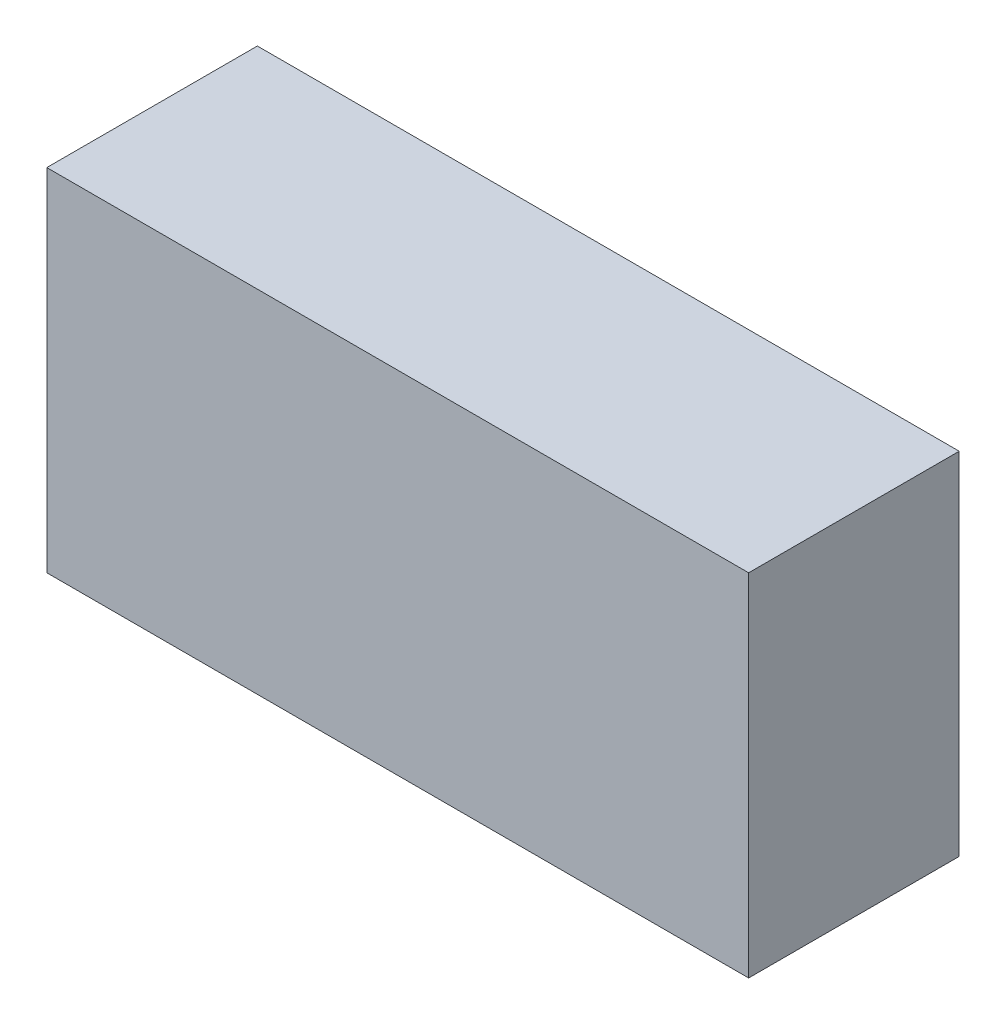
ISO-10303-21;
HEADER;
FILE_DESCRIPTION(('STEP AP214'),'2;1');
FILE_NAME('part.step','',(''),(''),'','','');
FILE_SCHEMA(('AUTOMOTIVE_DESIGN { 1 0 10303 214 1 1 1 1 }'));
ENDSEC;
DATA;
#1=APPLICATION_CONTEXT('core data for automotive mechanical design processes');
#2=APPLICATION_PROTOCOL_DEFINITION('international standard','automotive_design',2000,#1);
#3=PRODUCT_CONTEXT('',#1,'mechanical');
#4=PRODUCT('Part','Part','',(#3));
#5=PRODUCT_RELATED_PRODUCT_CATEGORY('part','',(#4));
#6=PRODUCT_DEFINITION_FORMATION('','',#4);
#7=PRODUCT_DEFINITION_CONTEXT('part definition',#1,'design');
#8=PRODUCT_DEFINITION('design','',#6,#7);
#9=PRODUCT_DEFINITION_SHAPE('','',#8);
#10=(LENGTH_UNIT() NAMED_UNIT(*) SI_UNIT(.MILLI.,.METRE.));
#11=(NAMED_UNIT(*) PLANE_ANGLE_UNIT() SI_UNIT($,.RADIAN.));
#12=(NAMED_UNIT(*) SI_UNIT($,.STERADIAN.) SOLID_ANGLE_UNIT());
#13=UNCERTAINTY_MEASURE_WITH_UNIT(LENGTH_MEASURE(1.E-05),#10,'distance_accuracy_value','');
#14=(GEOMETRIC_REPRESENTATION_CONTEXT(3) GLOBAL_UNCERTAINTY_ASSIGNED_CONTEXT((#13)) GLOBAL_UNIT_ASSIGNED_CONTEXT((#10,
#11,#12)) REPRESENTATION_CONTEXT('',''));
#15=CARTESIAN_POINT('',(0.,0.,0.));
#16=DIRECTION('',(0.,0.,1.));
#17=DIRECTION('',(1.,0.,0.));
#18=AXIS2_PLACEMENT_3D('',#15,#16,#17);
#19=CARTESIAN_POINT('',(0.,0.,12.));
#20=DIRECTION('',(1.,0.,0.));
#21=DIRECTION('',(0.,0.,-1.));
#22=AXIS2_PLACEMENT_3D('',#19,#20,#21);
#23=PLANE('',#22);
#24=DIRECTION('',(0.,-1.,0.));
#25=VECTOR('',#24,1.);
#26=CARTESIAN_POINT('',(0.,0.,0.));
#27=LINE('',#26,#25);
#28=CARTESIAN_POINT('',(0.,20.,0.));
#29=VERTEX_POINT('',#28);
#30=CARTESIAN_POINT('',(0.,0.,0.));
#31=VERTEX_POINT('',#30);
#32=EDGE_CURVE('E106',#29,#31,#27,.T.);
#33=ORIENTED_EDGE('',*,*,#32,.T.);
#34=DIRECTION('',(0.,0.,-1.));
#35=VECTOR('',#34,1.);
#36=CARTESIAN_POINT('',(0.,0.,12.));
#37=LINE('',#36,#35);
#38=CARTESIAN_POINT('',(0.,0.,12.));
#39=VERTEX_POINT('',#38);
#40=EDGE_CURVE('E11',#39,#31,#37,.T.);
#41=ORIENTED_EDGE('',*,*,#40,.F.);
#42=DIRECTION('',(0.,-1.,0.));
#43=VECTOR('',#42,1.);
#44=CARTESIAN_POINT('',(0.,0.,12.));
#45=LINE('',#44,#43);
#46=CARTESIAN_POINT('',(0.,20.,12.));
#47=VERTEX_POINT('',#46);
#48=EDGE_CURVE('E94',#47,#39,#45,.T.);
#49=ORIENTED_EDGE('',*,*,#48,.F.);
#50=DIRECTION('',(0.,0.,-1.));
#51=VECTOR('',#50,1.);
#52=CARTESIAN_POINT('',(0.,20.,12.));
#53=LINE('',#52,#51);
#54=EDGE_CURVE('E105',#47,#29,#53,.T.);
#55=ORIENTED_EDGE('',*,*,#54,.T.);
#56=EDGE_LOOP('',(#33,#41,#49,#55));
#57=FACE_BOUND('',#56,.T.);
#58=ADVANCED_FACE('F43',(#57),#23,.F.);
#59=CARTESIAN_POINT('',(0.,0.,12.));
#60=DIRECTION('',(0.,1.,0.));
#61=DIRECTION('',(0.,0.,1.));
#62=AXIS2_PLACEMENT_3D('',#59,#60,#61);
#63=PLANE('',#62);
#64=DIRECTION('',(1.,0.,0.));
#65=VECTOR('',#64,1.);
#66=CARTESIAN_POINT('',(0.,0.,0.));
#67=LINE('',#66,#65);
#68=CARTESIAN_POINT('',(40.,0.,0.));
#69=VERTEX_POINT('',#68);
#70=EDGE_CURVE('E98',#31,#69,#67,.T.);
#71=ORIENTED_EDGE('',*,*,#70,.T.);
#72=DIRECTION('',(0.,0.,-1.));
#73=VECTOR('',#72,1.);
#74=CARTESIAN_POINT('',(40.,0.,12.));
#75=LINE('',#74,#73);
#76=CARTESIAN_POINT('',(40.,0.,12.));
#77=VERTEX_POINT('',#76);
#78=EDGE_CURVE('E51',#77,#69,#75,.T.);
#79=ORIENTED_EDGE('',*,*,#78,.F.);
#80=DIRECTION('',(1.,0.,0.));
#81=VECTOR('',#80,1.);
#82=CARTESIAN_POINT('',(0.,0.,12.));
#83=LINE('',#82,#81);
#84=EDGE_CURVE('E90',#39,#77,#83,.T.);
#85=ORIENTED_EDGE('',*,*,#84,.F.);
#86=ORIENTED_EDGE('',*,*,#40,.T.);
#87=EDGE_LOOP('',(#71,#79,#85,#86));
#88=FACE_BOUND('',#87,.T.);
#89=ADVANCED_FACE('F100',(#88),#63,.F.);
#90=CARTESIAN_POINT('',(40.,0.,12.));
#91=DIRECTION('',(-1.,0.,0.));
#92=DIRECTION('',(0.,0.,1.));
#93=AXIS2_PLACEMENT_3D('',#90,#91,#92);
#94=PLANE('',#93);
#95=DIRECTION('',(0.,1.,0.));
#96=VECTOR('',#95,1.);
#97=CARTESIAN_POINT('',(40.,0.,0.));
#98=LINE('',#97,#96);
#99=CARTESIAN_POINT('',(40.,20.,0.));
#100=VERTEX_POINT('',#99);
#101=EDGE_CURVE('E77',#69,#100,#98,.T.);
#102=ORIENTED_EDGE('',*,*,#101,.T.);
#103=DIRECTION('',(0.,0.,-1.));
#104=VECTOR('',#103,1.);
#105=CARTESIAN_POINT('',(40.,20.,12.));
#106=LINE('',#105,#104);
#107=CARTESIAN_POINT('',(40.,20.,12.));
#108=VERTEX_POINT('',#107);
#109=EDGE_CURVE('E97',#108,#100,#106,.T.);
#110=ORIENTED_EDGE('',*,*,#109,.F.);
#111=DIRECTION('',(0.,1.,0.));
#112=VECTOR('',#111,1.);
#113=CARTESIAN_POINT('',(40.,0.,12.));
#114=LINE('',#113,#112);
#115=EDGE_CURVE('E95',#77,#108,#114,.T.);
#116=ORIENTED_EDGE('',*,*,#115,.F.);
#117=ORIENTED_EDGE('',*,*,#78,.T.);
#118=EDGE_LOOP('',(#102,#110,#116,#117));
#119=FACE_BOUND('',#118,.T.);
#120=ADVANCED_FACE('F99',(#119),#94,.F.);
#121=CARTESIAN_POINT('',(0.,20.,12.));
#122=DIRECTION('',(0.,-1.,0.));
#123=DIRECTION('',(0.,0.,-1.));
#124=AXIS2_PLACEMENT_3D('',#121,#122,#123);
#125=PLANE('',#124);
#126=DIRECTION('',(-1.,0.,0.));
#127=VECTOR('',#126,1.);
#128=CARTESIAN_POINT('',(0.,20.,0.));
#129=LINE('',#128,#127);
#130=EDGE_CURVE('E85',#100,#29,#129,.T.);
#131=ORIENTED_EDGE('',*,*,#130,.T.);
#132=ORIENTED_EDGE('',*,*,#54,.F.);
#133=DIRECTION('',(-1.,0.,0.));
#134=VECTOR('',#133,1.);
#135=CARTESIAN_POINT('',(0.,20.,12.));
#136=LINE('',#135,#134);
#137=EDGE_CURVE('E56',#108,#47,#136,.T.);
#138=ORIENTED_EDGE('',*,*,#137,.F.);
#139=ORIENTED_EDGE('',*,*,#109,.T.);
#140=EDGE_LOOP('',(#131,#132,#138,#139));
#141=FACE_BOUND('',#140,.T.);
#142=ADVANCED_FACE('F114',(#141),#125,.F.);
#143=CARTESIAN_POINT('',(0.,0.,12.));
#144=DIRECTION('',(0.,0.,-1.));
#145=DIRECTION('',(-1.,0.,0.));
#146=AXIS2_PLACEMENT_3D('',#143,#144,#145);
#147=PLANE('',#146);
#148=ORIENTED_EDGE('',*,*,#48,.T.);
#149=ORIENTED_EDGE('',*,*,#84,.T.);
#150=ORIENTED_EDGE('',*,*,#115,.T.);
#151=ORIENTED_EDGE('',*,*,#137,.T.);
#152=EDGE_LOOP('',(#148,#149,#150,#151));
#153=FACE_BOUND('',#152,.T.);
#154=ADVANCED_FACE('F89',(#153),#147,.F.);
#155=CARTESIAN_POINT('',(0.,0.,0.));
#156=DIRECTION('',(0.,0.,-1.));
#157=DIRECTION('',(-1.,0.,0.));
#158=AXIS2_PLACEMENT_3D('',#155,#156,#157);
#159=PLANE('',#158);
#160=ORIENTED_EDGE('',*,*,#32,.F.);
#161=ORIENTED_EDGE('',*,*,#130,.F.);
#162=ORIENTED_EDGE('',*,*,#101,.F.);
#163=ORIENTED_EDGE('',*,*,#70,.F.);
#164=EDGE_LOOP('',(#160,#161,#162,#163));
#165=FACE_BOUND('',#164,.T.);
#166=ADVANCED_FACE('F117',(#165),#159,.T.);
#167=CLOSED_SHELL('',(#58,#89,#120,#142,#154,#166));
#168=MANIFOLD_SOLID_BREP('B2',#167);
#169=ADVANCED_BREP_SHAPE_REPRESENTATION('',(#18,#168),#14);
#170=SHAPE_DEFINITION_REPRESENTATION(#9,#169);
ENDSEC;
END-ISO-10303-21;
